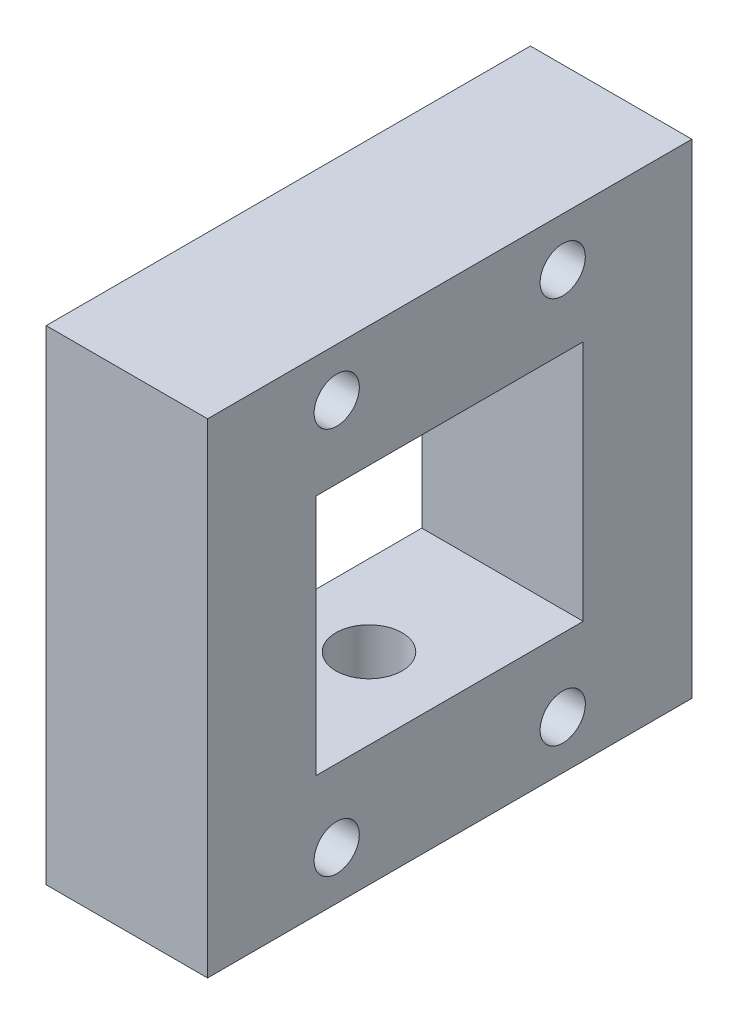
ISO-10303-21;
HEADER;
FILE_DESCRIPTION(('STEP AP214'),'2;1');
FILE_NAME('part.step','',(''),(''),'','','');
FILE_SCHEMA(('AUTOMOTIVE_DESIGN { 1 0 10303 214 1 1 1 1 }'));
ENDSEC;
DATA;
#1=APPLICATION_CONTEXT('core data for automotive mechanical design processes');
#2=APPLICATION_PROTOCOL_DEFINITION('international standard','automotive_design',2000,#1);
#3=PRODUCT_CONTEXT('',#1,'mechanical');
#4=PRODUCT('Part','Part','',(#3));
#5=PRODUCT_RELATED_PRODUCT_CATEGORY('part','',(#4));
#6=PRODUCT_DEFINITION_FORMATION('','',#4);
#7=PRODUCT_DEFINITION_CONTEXT('part definition',#1,'design');
#8=PRODUCT_DEFINITION('design','',#6,#7);
#9=PRODUCT_DEFINITION_SHAPE('','',#8);
#10=(LENGTH_UNIT() NAMED_UNIT(*) SI_UNIT(.MILLI.,.METRE.));
#11=(NAMED_UNIT(*) PLANE_ANGLE_UNIT() SI_UNIT($,.RADIAN.));
#12=(NAMED_UNIT(*) SI_UNIT($,.STERADIAN.) SOLID_ANGLE_UNIT());
#13=UNCERTAINTY_MEASURE_WITH_UNIT(LENGTH_MEASURE(1.E-05),#10,'distance_accuracy_value','');
#14=(GEOMETRIC_REPRESENTATION_CONTEXT(3) GLOBAL_UNCERTAINTY_ASSIGNED_CONTEXT((#13)) GLOBAL_UNIT_ASSIGNED_CONTEXT((#10,
#11,#12)) REPRESENTATION_CONTEXT('',''));
#15=CARTESIAN_POINT('',(0.,0.,0.));
#16=DIRECTION('',(0.,0.,1.));
#17=DIRECTION('',(1.,0.,0.));
#18=AXIS2_PLACEMENT_3D('',#15,#16,#17);
#19=CARTESIAN_POINT('',(10.,-12.,7.));
#20=DIRECTION('',(-1.,0.,0.));
#21=DIRECTION('',(0.,0.,1.));
#22=AXIS2_PLACEMENT_3D('',#19,#20,#21);
#23=CYLINDRICAL_SURFACE('',#22,1.4);
#24=CARTESIAN_POINT('',(1.875,-12.,7.));
#25=DIRECTION('',(-1.,0.,0.));
#26=DIRECTION('',(0.,0.,1.));
#27=AXIS2_PLACEMENT_3D('',#24,#25,#26);
#28=CIRCLE('',#27,1.4);
#29=CARTESIAN_POINT('',(1.875,-12.,8.4));
#30=VERTEX_POINT('',#29);
#31=EDGE_CURVE('E165',#30,#30,#28,.T.);
#32=ORIENTED_EDGE('',*,*,#31,.T.);
#33=EDGE_LOOP('',(#32));
#34=FACE_BOUND('',#33,.T.);
#35=CARTESIAN_POINT('',(10.,-12.,7.));
#36=DIRECTION('',(1.,0.,0.));
#37=DIRECTION('',(0.,0.,-1.));
#38=AXIS2_PLACEMENT_3D('',#35,#36,#37);
#39=CIRCLE('',#38,1.4);
#40=CARTESIAN_POINT('',(10.,-12.,5.6));
#41=VERTEX_POINT('',#40);
#42=EDGE_CURVE('E126',#41,#41,#39,.T.);
#43=ORIENTED_EDGE('',*,*,#42,.T.);
#44=EDGE_LOOP('',(#43));
#45=FACE_BOUND('',#44,.T.);
#46=ADVANCED_FACE('F32',(#34,#45),#23,.F.);
#47=CARTESIAN_POINT('',(10.,-12.,-7.));
#48=DIRECTION('',(-1.,0.,0.));
#49=DIRECTION('',(0.,0.,1.));
#50=AXIS2_PLACEMENT_3D('',#47,#48,#49);
#51=CYLINDRICAL_SURFACE('',#50,1.4);
#52=CARTESIAN_POINT('',(1.875,-12.,-7.));
#53=DIRECTION('',(-1.,0.,0.));
#54=DIRECTION('',(0.,0.,1.));
#55=AXIS2_PLACEMENT_3D('',#52,#53,#54);
#56=CIRCLE('',#55,1.4);
#57=CARTESIAN_POINT('',(1.875,-12.,-5.6));
#58=VERTEX_POINT('',#57);
#59=EDGE_CURVE('E174',#58,#58,#56,.T.);
#60=ORIENTED_EDGE('',*,*,#59,.T.);
#61=EDGE_LOOP('',(#60));
#62=FACE_BOUND('',#61,.T.);
#63=CARTESIAN_POINT('',(10.,-12.,-7.));
#64=DIRECTION('',(1.,0.,0.));
#65=DIRECTION('',(0.,0.,1.));
#66=AXIS2_PLACEMENT_3D('',#63,#64,#65);
#67=CIRCLE('',#66,1.4);
#68=CARTESIAN_POINT('',(10.,-12.,-5.6));
#69=VERTEX_POINT('',#68);
#70=EDGE_CURVE('E273',#69,#69,#67,.T.);
#71=ORIENTED_EDGE('',*,*,#70,.T.);
#72=EDGE_LOOP('',(#71));
#73=FACE_BOUND('',#72,.T.);
#74=ADVANCED_FACE('F196',(#62,#73),#51,.F.);
#75=CARTESIAN_POINT('',(10.,12.,7.));
#76=DIRECTION('',(-1.,0.,0.));
#77=DIRECTION('',(0.,0.,1.));
#78=AXIS2_PLACEMENT_3D('',#75,#76,#77);
#79=CYLINDRICAL_SURFACE('',#78,1.4);
#80=CARTESIAN_POINT('',(1.875,12.,7.));
#81=DIRECTION('',(-1.,0.,0.));
#82=DIRECTION('',(0.,0.,1.));
#83=AXIS2_PLACEMENT_3D('',#80,#81,#82);
#84=CIRCLE('',#83,1.4);
#85=CARTESIAN_POINT('',(1.875,12.,8.4));
#86=VERTEX_POINT('',#85);
#87=EDGE_CURVE('E168',#86,#86,#84,.T.);
#88=ORIENTED_EDGE('',*,*,#87,.T.);
#89=EDGE_LOOP('',(#88));
#90=FACE_BOUND('',#89,.T.);
#91=CARTESIAN_POINT('',(10.,12.,7.));
#92=DIRECTION('',(1.,0.,0.));
#93=DIRECTION('',(0.,0.,1.));
#94=AXIS2_PLACEMENT_3D('',#91,#92,#93);
#95=CIRCLE('',#94,1.4);
#96=CARTESIAN_POINT('',(10.,12.,8.4));
#97=VERTEX_POINT('',#96);
#98=EDGE_CURVE('E275',#97,#97,#95,.T.);
#99=ORIENTED_EDGE('',*,*,#98,.T.);
#100=EDGE_LOOP('',(#99));
#101=FACE_BOUND('',#100,.T.);
#102=ADVANCED_FACE('F202',(#90,#101),#79,.F.);
#103=CARTESIAN_POINT('',(10.,12.,-7.));
#104=DIRECTION('',(-1.,0.,0.));
#105=DIRECTION('',(0.,0.,1.));
#106=AXIS2_PLACEMENT_3D('',#103,#104,#105);
#107=CYLINDRICAL_SURFACE('',#106,1.4);
#108=CARTESIAN_POINT('',(1.875,12.,-7.));
#109=DIRECTION('',(-1.,0.,0.));
#110=DIRECTION('',(0.,0.,1.));
#111=AXIS2_PLACEMENT_3D('',#108,#109,#110);
#112=CIRCLE('',#111,1.4);
#113=CARTESIAN_POINT('',(1.875,12.,-5.6));
#114=VERTEX_POINT('',#113);
#115=EDGE_CURVE('E171',#114,#114,#112,.T.);
#116=ORIENTED_EDGE('',*,*,#115,.T.);
#117=EDGE_LOOP('',(#116));
#118=FACE_BOUND('',#117,.T.);
#119=CARTESIAN_POINT('',(10.,12.,-7.));
#120=DIRECTION('',(1.,0.,0.));
#121=DIRECTION('',(0.,0.,-1.));
#122=AXIS2_PLACEMENT_3D('',#119,#120,#121);
#123=CIRCLE('',#122,1.4);
#124=CARTESIAN_POINT('',(10.,12.,-8.4));
#125=VERTEX_POINT('',#124);
#126=EDGE_CURVE('E276',#125,#125,#123,.T.);
#127=ORIENTED_EDGE('',*,*,#126,.T.);
#128=EDGE_LOOP('',(#127));
#129=FACE_BOUND('',#128,.T.);
#130=ADVANCED_FACE('F225',(#118,#129),#107,.F.);
#131=CARTESIAN_POINT('',(10.,0.,0.));
#132=DIRECTION('',(1.,0.,0.));
#133=DIRECTION('',(0.,0.,-1.));
#134=AXIS2_PLACEMENT_3D('',#131,#132,#133);
#135=PLANE('',#134);
#136=ORIENTED_EDGE('',*,*,#126,.F.);
#137=EDGE_LOOP('',(#136));
#138=FACE_BOUND('',#137,.T.);
#139=ORIENTED_EDGE('',*,*,#70,.F.);
#140=EDGE_LOOP('',(#139));
#141=FACE_BOUND('',#140,.T.);
#142=ORIENTED_EDGE('',*,*,#98,.F.);
#143=EDGE_LOOP('',(#142));
#144=FACE_BOUND('',#143,.T.);
#145=ORIENTED_EDGE('',*,*,#42,.F.);
#146=EDGE_LOOP('',(#145));
#147=FACE_BOUND('',#146,.T.);
#148=DIRECTION('',(0.,1.,0.));
#149=VECTOR('',#148,1.);
#150=CARTESIAN_POINT('',(10.,15.,-15.));
#151=LINE('',#150,#149);
#152=CARTESIAN_POINT('',(10.,-15.,-15.));
#153=VERTEX_POINT('',#152);
#154=CARTESIAN_POINT('',(10.,15.,-15.));
#155=VERTEX_POINT('',#154);
#156=EDGE_CURVE('E136',#153,#155,#151,.T.);
#157=ORIENTED_EDGE('',*,*,#156,.T.);
#158=DIRECTION('',(0.,0.,1.));
#159=VECTOR('',#158,1.);
#160=CARTESIAN_POINT('',(10.,15.,15.));
#161=LINE('',#160,#159);
#162=CARTESIAN_POINT('',(10.,15.,15.));
#163=VERTEX_POINT('',#162);
#164=EDGE_CURVE('E139',#155,#163,#161,.T.);
#165=ORIENTED_EDGE('',*,*,#164,.T.);
#166=DIRECTION('',(0.,-1.,0.));
#167=VECTOR('',#166,1.);
#168=CARTESIAN_POINT('',(10.,15.,15.));
#169=LINE('',#168,#167);
#170=CARTESIAN_POINT('',(10.,-15.,15.));
#171=VERTEX_POINT('',#170);
#172=EDGE_CURVE('E142',#163,#171,#169,.T.);
#173=ORIENTED_EDGE('',*,*,#172,.T.);
#174=DIRECTION('',(0.,0.,-1.));
#175=VECTOR('',#174,1.);
#176=CARTESIAN_POINT('',(10.,-15.,15.));
#177=LINE('',#176,#175);
#178=EDGE_CURVE('E144',#171,#153,#177,.T.);
#179=ORIENTED_EDGE('',*,*,#178,.T.);
#180=EDGE_LOOP('',(#157,#165,#173,#179));
#181=FACE_BOUND('',#180,.T.);
#182=DIRECTION('',(0.,0.,1.));
#183=VECTOR('',#182,1.);
#184=CARTESIAN_POINT('',(10.,7.49999999999999,8.27025084197812));
#185=LINE('',#184,#183);
#186=CARTESIAN_POINT('',(10.,7.49999999999999,-8.27025084197812));
#187=VERTEX_POINT('',#186);
#188=CARTESIAN_POINT('',(10.,7.49999999999999,8.27025084197812));
#189=VERTEX_POINT('',#188);
#190=EDGE_CURVE('E105',#187,#189,#185,.T.);
#191=ORIENTED_EDGE('',*,*,#190,.F.);
#192=DIRECTION('',(0.,1.,0.));
#193=VECTOR('',#192,1.);
#194=CARTESIAN_POINT('',(10.,7.49999999999999,-8.27025084197812));
#195=LINE('',#194,#193);
#196=CARTESIAN_POINT('',(10.,-7.50000000000001,-8.27025084197812));
#197=VERTEX_POINT('',#196);
#198=EDGE_CURVE('E97',#197,#187,#195,.T.);
#199=ORIENTED_EDGE('',*,*,#198,.F.);
#200=DIRECTION('',(0.,0.,-1.));
#201=VECTOR('',#200,1.);
#202=CARTESIAN_POINT('',(10.,-7.50000000000001,8.27025084197812));
#203=LINE('',#202,#201);
#204=CARTESIAN_POINT('',(10.,-7.50000000000001,8.27025084197812));
#205=VERTEX_POINT('',#204);
#206=EDGE_CURVE('E120',#205,#197,#203,.T.);
#207=ORIENTED_EDGE('',*,*,#206,.F.);
#208=DIRECTION('',(0.,-1.,0.));
#209=VECTOR('',#208,1.);
#210=CARTESIAN_POINT('',(10.,7.49999999999999,8.27025084197812));
#211=LINE('',#210,#209);
#212=EDGE_CURVE('E118',#189,#205,#211,.T.);
#213=ORIENTED_EDGE('',*,*,#212,.F.);
#214=EDGE_LOOP('',(#191,#199,#207,#213));
#215=FACE_BOUND('',#214,.T.);
#216=ADVANCED_FACE('F117',(#138,#141,#144,#147,#181,#215),#135,.T.);
#217=CARTESIAN_POINT('',(0.,0.,0.));
#218=DIRECTION('',(1.,0.,0.));
#219=DIRECTION('',(0.,0.,-1.));
#220=AXIS2_PLACEMENT_3D('',#217,#218,#219);
#221=PLANE('',#220);
#222=CARTESIAN_POINT('',(0.,-12.,7.));
#223=DIRECTION('',(-1.,0.,0.));
#224=DIRECTION('',(0.,0.,1.));
#225=AXIS2_PLACEMENT_3D('',#222,#223,#224);
#226=CIRCLE('',#225,2.9);
#227=CARTESIAN_POINT('',(0.,-12.,9.9));
#228=VERTEX_POINT('',#227);
#229=EDGE_CURVE('E308',#228,#228,#226,.T.);
#230=ORIENTED_EDGE('',*,*,#229,.F.);
#231=EDGE_LOOP('',(#230));
#232=FACE_BOUND('',#231,.T.);
#233=CARTESIAN_POINT('',(0.,-12.,-7.));
#234=DIRECTION('',(-1.,0.,0.));
#235=DIRECTION('',(0.,0.,1.));
#236=AXIS2_PLACEMENT_3D('',#233,#234,#235);
#237=CIRCLE('',#236,2.9);
#238=CARTESIAN_POINT('',(0.,-12.,-4.1));
#239=VERTEX_POINT('',#238);
#240=EDGE_CURVE('E268',#239,#239,#237,.T.);
#241=ORIENTED_EDGE('',*,*,#240,.F.);
#242=EDGE_LOOP('',(#241));
#243=FACE_BOUND('',#242,.T.);
#244=CARTESIAN_POINT('',(0.,12.,7.));
#245=DIRECTION('',(-1.,0.,0.));
#246=DIRECTION('',(0.,0.,1.));
#247=AXIS2_PLACEMENT_3D('',#244,#245,#246);
#248=CIRCLE('',#247,2.9);
#249=CARTESIAN_POINT('',(0.,12.,9.9));
#250=VERTEX_POINT('',#249);
#251=EDGE_CURVE('E304',#250,#250,#248,.T.);
#252=ORIENTED_EDGE('',*,*,#251,.F.);
#253=EDGE_LOOP('',(#252));
#254=FACE_BOUND('',#253,.T.);
#255=CARTESIAN_POINT('',(0.,12.,-7.));
#256=DIRECTION('',(-1.,0.,0.));
#257=DIRECTION('',(0.,0.,1.));
#258=AXIS2_PLACEMENT_3D('',#255,#256,#257);
#259=CIRCLE('',#258,2.9);
#260=CARTESIAN_POINT('',(0.,12.,-4.1));
#261=VERTEX_POINT('',#260);
#262=EDGE_CURVE('E281',#261,#261,#259,.T.);
#263=ORIENTED_EDGE('',*,*,#262,.F.);
#264=EDGE_LOOP('',(#263));
#265=FACE_BOUND('',#264,.T.);
#266=DIRECTION('',(0.,1.,0.));
#267=VECTOR('',#266,1.);
#268=CARTESIAN_POINT('',(0.,15.,-15.));
#269=LINE('',#268,#267);
#270=CARTESIAN_POINT('',(0.,-15.,-15.));
#271=VERTEX_POINT('',#270);
#272=CARTESIAN_POINT('',(0.,15.,-15.));
#273=VERTEX_POINT('',#272);
#274=EDGE_CURVE('E113',#271,#273,#269,.T.);
#275=ORIENTED_EDGE('',*,*,#274,.F.);
#276=DIRECTION('',(0.,0.,-1.));
#277=VECTOR('',#276,1.);
#278=CARTESIAN_POINT('',(0.,-15.,15.));
#279=LINE('',#278,#277);
#280=CARTESIAN_POINT('',(0.,-15.,15.));
#281=VERTEX_POINT('',#280);
#282=EDGE_CURVE('E140',#281,#271,#279,.T.);
#283=ORIENTED_EDGE('',*,*,#282,.F.);
#284=DIRECTION('',(0.,-1.,0.));
#285=VECTOR('',#284,1.);
#286=CARTESIAN_POINT('',(0.,15.,15.));
#287=LINE('',#286,#285);
#288=CARTESIAN_POINT('',(0.,15.,15.));
#289=VERTEX_POINT('',#288);
#290=EDGE_CURVE('E151',#289,#281,#287,.T.);
#291=ORIENTED_EDGE('',*,*,#290,.F.);
#292=DIRECTION('',(0.,0.,1.));
#293=VECTOR('',#292,1.);
#294=CARTESIAN_POINT('',(0.,15.,15.));
#295=LINE('',#294,#293);
#296=EDGE_CURVE('E149',#273,#289,#295,.T.);
#297=ORIENTED_EDGE('',*,*,#296,.F.);
#298=EDGE_LOOP('',(#275,#283,#291,#297));
#299=FACE_BOUND('',#298,.T.);
#300=DIRECTION('',(0.,1.,0.));
#301=VECTOR('',#300,1.);
#302=CARTESIAN_POINT('',(0.,7.49999999999999,-8.27025084197812));
#303=LINE('',#302,#301);
#304=CARTESIAN_POINT('',(0.,-7.50000000000001,-8.27025084197812));
#305=VERTEX_POINT('',#304);
#306=CARTESIAN_POINT('',(0.,7.49999999999999,-8.27025084197812));
#307=VERTEX_POINT('',#306);
#308=EDGE_CURVE('E55',#305,#307,#303,.T.);
#309=ORIENTED_EDGE('',*,*,#308,.T.);
#310=DIRECTION('',(0.,0.,1.));
#311=VECTOR('',#310,1.);
#312=CARTESIAN_POINT('',(0.,7.49999999999999,8.27025084197812));
#313=LINE('',#312,#311);
#314=CARTESIAN_POINT('',(0.,7.49999999999999,8.27025084197812));
#315=VERTEX_POINT('',#314);
#316=EDGE_CURVE('E112',#307,#315,#313,.T.);
#317=ORIENTED_EDGE('',*,*,#316,.T.);
#318=DIRECTION('',(0.,-1.,0.));
#319=VECTOR('',#318,1.);
#320=CARTESIAN_POINT('',(0.,7.49999999999999,8.27025084197812));
#321=LINE('',#320,#319);
#322=CARTESIAN_POINT('',(0.,-7.50000000000001,8.27025084197812));
#323=VERTEX_POINT('',#322);
#324=EDGE_CURVE('E128',#315,#323,#321,.T.);
#325=ORIENTED_EDGE('',*,*,#324,.T.);
#326=DIRECTION('',(0.,0.,-1.));
#327=VECTOR('',#326,1.);
#328=CARTESIAN_POINT('',(0.,-7.50000000000001,8.27025084197812));
#329=LINE('',#328,#327);
#330=EDGE_CURVE('E106',#323,#305,#329,.T.);
#331=ORIENTED_EDGE('',*,*,#330,.T.);
#332=EDGE_LOOP('',(#309,#317,#325,#331));
#333=FACE_BOUND('',#332,.T.);
#334=ADVANCED_FACE('F224',(#232,#243,#254,#265,#299,#333),#221,.F.);
#335=CARTESIAN_POINT('',(10.,15.,-15.));
#336=DIRECTION('',(0.,0.,1.));
#337=DIRECTION('',(0.,-1.,0.));
#338=AXIS2_PLACEMENT_3D('',#335,#336,#337);
#339=PLANE('',#338);
#340=ORIENTED_EDGE('',*,*,#274,.T.);
#341=DIRECTION('',(-1.,0.,0.));
#342=VECTOR('',#341,1.);
#343=CARTESIAN_POINT('',(10.,15.,-15.));
#344=LINE('',#343,#342);
#345=EDGE_CURVE('E162',#155,#273,#344,.T.);
#346=ORIENTED_EDGE('',*,*,#345,.F.);
#347=ORIENTED_EDGE('',*,*,#156,.F.);
#348=DIRECTION('',(-1.,0.,0.));
#349=VECTOR('',#348,1.);
#350=CARTESIAN_POINT('',(10.,-15.,-15.));
#351=LINE('',#350,#349);
#352=EDGE_CURVE('E146',#153,#271,#351,.T.);
#353=ORIENTED_EDGE('',*,*,#352,.T.);
#354=EDGE_LOOP('',(#340,#346,#347,#353));
#355=FACE_BOUND('',#354,.T.);
#356=ADVANCED_FACE('F229',(#355),#339,.F.);
#357=CARTESIAN_POINT('',(10.,15.,15.));
#358=DIRECTION('',(0.,-1.,0.));
#359=DIRECTION('',(0.,0.,-1.));
#360=AXIS2_PLACEMENT_3D('',#357,#358,#359);
#361=PLANE('',#360);
#362=ORIENTED_EDGE('',*,*,#296,.T.);
#363=DIRECTION('',(-1.,0.,0.));
#364=VECTOR('',#363,1.);
#365=CARTESIAN_POINT('',(10.,15.,15.));
#366=LINE('',#365,#364);
#367=EDGE_CURVE('E159',#163,#289,#366,.T.);
#368=ORIENTED_EDGE('',*,*,#367,.F.);
#369=ORIENTED_EDGE('',*,*,#164,.F.);
#370=ORIENTED_EDGE('',*,*,#345,.T.);
#371=EDGE_LOOP('',(#362,#368,#369,#370));
#372=FACE_BOUND('',#371,.T.);
#373=ADVANCED_FACE('F237',(#372),#361,.F.);
#374=CARTESIAN_POINT('',(10.,15.,15.));
#375=DIRECTION('',(0.,0.,-1.));
#376=DIRECTION('',(0.,1.,0.));
#377=AXIS2_PLACEMENT_3D('',#374,#375,#376);
#378=PLANE('',#377);
#379=ORIENTED_EDGE('',*,*,#290,.T.);
#380=DIRECTION('',(-1.,0.,0.));
#381=VECTOR('',#380,1.);
#382=CARTESIAN_POINT('',(10.,-15.,15.));
#383=LINE('',#382,#381);
#384=EDGE_CURVE('E156',#171,#281,#383,.T.);
#385=ORIENTED_EDGE('',*,*,#384,.F.);
#386=ORIENTED_EDGE('',*,*,#172,.F.);
#387=ORIENTED_EDGE('',*,*,#367,.T.);
#388=EDGE_LOOP('',(#379,#385,#386,#387));
#389=FACE_BOUND('',#388,.T.);
#390=ADVANCED_FACE('F233',(#389),#378,.F.);
#391=CARTESIAN_POINT('',(10.,-15.,15.));
#392=DIRECTION('',(0.,1.,0.));
#393=DIRECTION('',(0.,0.,1.));
#394=AXIS2_PLACEMENT_3D('',#391,#392,#393);
#395=PLANE('',#394);
#396=CARTESIAN_POINT('',(5.,-15.,0.));
#397=DIRECTION('',(0.,1.,0.));
#398=DIRECTION('',(0.,0.,1.));
#399=AXIS2_PLACEMENT_3D('',#396,#397,#398);
#400=CIRCLE('',#399,2.05);
#401=CARTESIAN_POINT('',(5.,-15.,2.05));
#402=VERTEX_POINT('',#401);
#403=EDGE_CURVE('E179',#402,#402,#400,.T.);
#404=ORIENTED_EDGE('',*,*,#403,.T.);
#405=EDGE_LOOP('',(#404));
#406=FACE_BOUND('',#405,.T.);
#407=ORIENTED_EDGE('',*,*,#282,.T.);
#408=ORIENTED_EDGE('',*,*,#352,.F.);
#409=ORIENTED_EDGE('',*,*,#178,.F.);
#410=ORIENTED_EDGE('',*,*,#384,.T.);
#411=EDGE_LOOP('',(#407,#408,#409,#410));
#412=FACE_BOUND('',#411,.T.);
#413=ADVANCED_FACE('F221',(#406,#412),#395,.F.);
#414=CARTESIAN_POINT('',(10.,7.49999999999999,-8.27025084197812));
#415=DIRECTION('',(0.,0.,1.));
#416=DIRECTION('',(0.,-1.,0.));
#417=AXIS2_PLACEMENT_3D('',#414,#415,#416);
#418=PLANE('',#417);
#419=ORIENTED_EDGE('',*,*,#308,.F.);
#420=DIRECTION('',(-1.,0.,0.));
#421=VECTOR('',#420,1.);
#422=CARTESIAN_POINT('',(10.,-7.50000000000001,-8.27025084197812));
#423=LINE('',#422,#421);
#424=EDGE_CURVE('E101',#197,#305,#423,.T.);
#425=ORIENTED_EDGE('',*,*,#424,.F.);
#426=ORIENTED_EDGE('',*,*,#198,.T.);
#427=DIRECTION('',(-1.,0.,0.));
#428=VECTOR('',#427,1.);
#429=CARTESIAN_POINT('',(10.,7.49999999999999,-8.27025084197812));
#430=LINE('',#429,#428);
#431=EDGE_CURVE('E100',#187,#307,#430,.T.);
#432=ORIENTED_EDGE('',*,*,#431,.T.);
#433=EDGE_LOOP('',(#419,#425,#426,#432));
#434=FACE_BOUND('',#433,.T.);
#435=ADVANCED_FACE('F99',(#434),#418,.T.);
#436=CARTESIAN_POINT('',(10.,7.49999999999999,8.27025084197812));
#437=DIRECTION('',(0.,-1.,0.));
#438=DIRECTION('',(0.,0.,-1.));
#439=AXIS2_PLACEMENT_3D('',#436,#437,#438);
#440=PLANE('',#439);
#441=CARTESIAN_POINT('',(5.,7.49999999999999,0.));
#442=DIRECTION('',(0.,-1.,0.));
#443=DIRECTION('',(0.,0.,-1.));
#444=AXIS2_PLACEMENT_3D('',#441,#442,#443);
#445=CIRCLE('',#444,2.8);
#446=CARTESIAN_POINT('',(5.,7.49999999999999,-2.79999999999999));
#447=VERTEX_POINT('',#446);
#448=EDGE_CURVE('E313',#447,#447,#445,.T.);
#449=ORIENTED_EDGE('',*,*,#448,.F.);
#450=EDGE_LOOP('',(#449));
#451=FACE_BOUND('',#450,.T.);
#452=ORIENTED_EDGE('',*,*,#316,.F.);
#453=ORIENTED_EDGE('',*,*,#431,.F.);
#454=ORIENTED_EDGE('',*,*,#190,.T.);
#455=DIRECTION('',(-1.,0.,0.));
#456=VECTOR('',#455,1.);
#457=CARTESIAN_POINT('',(10.,7.49999999999999,8.27025084197812));
#458=LINE('',#457,#456);
#459=EDGE_CURVE('E114',#189,#315,#458,.T.);
#460=ORIENTED_EDGE('',*,*,#459,.T.);
#461=EDGE_LOOP('',(#452,#453,#454,#460));
#462=FACE_BOUND('',#461,.T.);
#463=ADVANCED_FACE('F109',(#451,#462),#440,.T.);
#464=CARTESIAN_POINT('',(10.,7.49999999999999,8.27025084197812));
#465=DIRECTION('',(0.,0.,-1.));
#466=DIRECTION('',(0.,1.,0.));
#467=AXIS2_PLACEMENT_3D('',#464,#465,#466);
#468=PLANE('',#467);
#469=ORIENTED_EDGE('',*,*,#324,.F.);
#470=ORIENTED_EDGE('',*,*,#459,.F.);
#471=ORIENTED_EDGE('',*,*,#212,.T.);
#472=DIRECTION('',(-1.,0.,0.));
#473=VECTOR('',#472,1.);
#474=CARTESIAN_POINT('',(10.,-7.50000000000001,8.27025084197812));
#475=LINE('',#474,#473);
#476=EDGE_CURVE('E47',#205,#323,#475,.T.);
#477=ORIENTED_EDGE('',*,*,#476,.T.);
#478=EDGE_LOOP('',(#469,#470,#471,#477));
#479=FACE_BOUND('',#478,.T.);
#480=ADVANCED_FACE('F212',(#479),#468,.T.);
#481=CARTESIAN_POINT('',(10.,-7.50000000000001,8.27025084197812));
#482=DIRECTION('',(0.,1.,0.));
#483=DIRECTION('',(0.,0.,1.));
#484=AXIS2_PLACEMENT_3D('',#481,#482,#483);
#485=PLANE('',#484);
#486=CARTESIAN_POINT('',(5.,-7.50000000000001,0.));
#487=DIRECTION('',(0.,1.,0.));
#488=DIRECTION('',(0.,0.,1.));
#489=AXIS2_PLACEMENT_3D('',#486,#487,#488);
#490=CIRCLE('',#489,2.05);
#491=CARTESIAN_POINT('',(5.,-7.50000000000001,2.05));
#492=VERTEX_POINT('',#491);
#493=EDGE_CURVE('E177',#492,#492,#490,.T.);
#494=ORIENTED_EDGE('',*,*,#493,.F.);
#495=EDGE_LOOP('',(#494));
#496=FACE_BOUND('',#495,.T.);
#497=ORIENTED_EDGE('',*,*,#330,.F.);
#498=ORIENTED_EDGE('',*,*,#476,.F.);
#499=ORIENTED_EDGE('',*,*,#206,.T.);
#500=ORIENTED_EDGE('',*,*,#424,.T.);
#501=EDGE_LOOP('',(#497,#498,#499,#500));
#502=FACE_BOUND('',#501,.T.);
#503=ADVANCED_FACE('F208',(#496,#502),#485,.T.);
#504=CARTESIAN_POINT('',(2.,-12.,7.));
#505=DIRECTION('',(-1.,0.,0.));
#506=DIRECTION('',(0.,0.,1.));
#507=AXIS2_PLACEMENT_3D('',#504,#505,#506);
#508=CONICAL_SURFACE('',#507,1.3,0.674740942223553);
#509=ORIENTED_EDGE('',*,*,#229,.T.);
#510=EDGE_LOOP('',(#509));
#511=FACE_BOUND('',#510,.T.);
#512=ORIENTED_EDGE('',*,*,#31,.F.);
#513=EDGE_LOOP('',(#512));
#514=FACE_BOUND('',#513,.T.);
#515=ADVANCED_FACE('F211',(#511,#514),#508,.F.);
#516=CARTESIAN_POINT('',(2.,12.,7.));
#517=DIRECTION('',(-1.,0.,0.));
#518=DIRECTION('',(0.,0.,1.));
#519=AXIS2_PLACEMENT_3D('',#516,#517,#518);
#520=CONICAL_SURFACE('',#519,1.3,0.674740942223553);
#521=ORIENTED_EDGE('',*,*,#251,.T.);
#522=EDGE_LOOP('',(#521));
#523=FACE_BOUND('',#522,.T.);
#524=ORIENTED_EDGE('',*,*,#87,.F.);
#525=EDGE_LOOP('',(#524));
#526=FACE_BOUND('',#525,.T.);
#527=ADVANCED_FACE('F247',(#523,#526),#520,.F.);
#528=CARTESIAN_POINT('',(2.,12.,-7.));
#529=DIRECTION('',(-1.,0.,0.));
#530=DIRECTION('',(0.,0.,1.));
#531=AXIS2_PLACEMENT_3D('',#528,#529,#530);
#532=CONICAL_SURFACE('',#531,1.3,0.674740942223553);
#533=ORIENTED_EDGE('',*,*,#262,.T.);
#534=EDGE_LOOP('',(#533));
#535=FACE_BOUND('',#534,.T.);
#536=ORIENTED_EDGE('',*,*,#115,.F.);
#537=EDGE_LOOP('',(#536));
#538=FACE_BOUND('',#537,.T.);
#539=ADVANCED_FACE('F251',(#535,#538),#532,.F.);
#540=CARTESIAN_POINT('',(2.,-12.,-7.));
#541=DIRECTION('',(-1.,0.,0.));
#542=DIRECTION('',(0.,0.,1.));
#543=AXIS2_PLACEMENT_3D('',#540,#541,#542);
#544=CONICAL_SURFACE('',#543,1.3,0.674740942223553);
#545=ORIENTED_EDGE('',*,*,#240,.T.);
#546=EDGE_LOOP('',(#545));
#547=FACE_BOUND('',#546,.T.);
#548=ORIENTED_EDGE('',*,*,#59,.F.);
#549=EDGE_LOOP('',(#548));
#550=FACE_BOUND('',#549,.T.);
#551=ADVANCED_FACE('F254',(#547,#550),#544,.F.);
#552=CARTESIAN_POINT('',(5.,-20.,0.));
#553=DIRECTION('',(0.,1.,0.));
#554=DIRECTION('',(0.,0.,1.));
#555=AXIS2_PLACEMENT_3D('',#552,#553,#554);
#556=CYLINDRICAL_SURFACE('',#555,2.05);
#557=ORIENTED_EDGE('',*,*,#493,.T.);
#558=EDGE_LOOP('',(#557));
#559=FACE_BOUND('',#558,.T.);
#560=ORIENTED_EDGE('',*,*,#403,.F.);
#561=EDGE_LOOP('',(#560));
#562=FACE_BOUND('',#561,.T.);
#563=ADVANCED_FACE('F257',(#559,#562),#556,.F.);
#564=CARTESIAN_POINT('',(5.,12.5,0.));
#565=DIRECTION('',(0.,-1.,0.));
#566=DIRECTION('',(0.,0.,-1.));
#567=AXIS2_PLACEMENT_3D('',#564,#565,#566);
#568=CYLINDRICAL_SURFACE('',#567,2.8);
#569=CARTESIAN_POINT('',(5.,12.5,0.));
#570=DIRECTION('',(0.,-1.,0.));
#571=DIRECTION('',(0.,0.,-1.));
#572=AXIS2_PLACEMENT_3D('',#569,#570,#571);
#573=CIRCLE('',#572,2.8);
#574=CARTESIAN_POINT('',(5.,12.5,-2.79999999999999));
#575=VERTEX_POINT('',#574);
#576=EDGE_CURVE('E180',#575,#575,#573,.T.);
#577=ORIENTED_EDGE('',*,*,#576,.F.);
#578=EDGE_LOOP('',(#577));
#579=FACE_BOUND('',#578,.T.);
#580=ORIENTED_EDGE('',*,*,#448,.T.);
#581=EDGE_LOOP('',(#580));
#582=FACE_BOUND('',#581,.T.);
#583=ADVANCED_FACE('F262',(#579,#582),#568,.F.);
#584=CARTESIAN_POINT('',(5.,12.5,0.));
#585=DIRECTION('',(0.,-1.,0.));
#586=DIRECTION('',(0.,0.,-1.));
#587=AXIS2_PLACEMENT_3D('',#584,#585,#586);
#588=PLANE('',#587);
#589=CARTESIAN_POINT('',(5.,12.5,0.));
#590=DIRECTION('',(0.,-1.,0.));
#591=DIRECTION('',(0.,0.,-1.));
#592=AXIS2_PLACEMENT_3D('',#589,#590,#591);
#593=CIRCLE('',#592,2.2);
#594=CARTESIAN_POINT('',(5.,12.5,-2.19999999999999));
#595=VERTEX_POINT('',#594);
#596=EDGE_CURVE('E316',#595,#595,#593,.T.);
#597=ORIENTED_EDGE('',*,*,#596,.F.);
#598=EDGE_LOOP('',(#597));
#599=FACE_BOUND('',#598,.T.);
#600=ORIENTED_EDGE('',*,*,#576,.T.);
#601=EDGE_LOOP('',(#600));
#602=FACE_BOUND('',#601,.T.);
#603=ADVANCED_FACE('F323',(#599,#602),#588,.T.);
#604=CARTESIAN_POINT('',(5.,12.5,0.));
#605=DIRECTION('',(0.,-1.,0.));
#606=DIRECTION('',(0.,0.,-1.));
#607=AXIS2_PLACEMENT_3D('',#604,#605,#606);
#608=CYLINDRICAL_SURFACE('',#607,2.2);
#609=CARTESIAN_POINT('',(5.,8.49999999999999,0.));
#610=DIRECTION('',(0.,-1.,0.));
#611=DIRECTION('',(0.,0.,-1.));
#612=AXIS2_PLACEMENT_3D('',#609,#610,#611);
#613=CIRCLE('',#612,2.2);
#614=CARTESIAN_POINT('',(5.,8.49999999999999,-2.19999999999999));
#615=VERTEX_POINT('',#614);
#616=EDGE_CURVE('E11',#615,#615,#613,.F.);
#617=ORIENTED_EDGE('',*,*,#616,.T.);
#618=EDGE_LOOP('',(#617));
#619=FACE_BOUND('',#618,.T.);
#620=ORIENTED_EDGE('',*,*,#596,.T.);
#621=EDGE_LOOP('',(#620));
#622=FACE_BOUND('',#621,.T.);
#623=ADVANCED_FACE('F192',(#619,#622),#608,.T.);
#624=CARTESIAN_POINT('',(5.,7.49999999999999,0.));
#625=DIRECTION('',(0.,-1.,0.));
#626=DIRECTION('',(0.,0.,-1.));
#627=AXIS2_PLACEMENT_3D('',#624,#625,#626);
#628=CIRCLE('',#627,1.2);
#629=CARTESIAN_POINT('',(5.,7.49999999999999,-1.19999999999999));
#630=VERTEX_POINT('',#629);
#631=EDGE_CURVE('E40',#630,#630,#628,.T.);
#632=ORIENTED_EDGE('',*,*,#631,.T.);
#633=EDGE_LOOP('',(#632));
#634=FACE_BOUND('',#633,.T.);
#635=ADVANCED_FACE('F184',(#634),#440,.T.);
#636=CARTESIAN_POINT('',(5.,8.49999999999999,0.));
#637=DIRECTION('',(0.,-1.,0.));
#638=DIRECTION('',(0.,0.,-1.));
#639=AXIS2_PLACEMENT_3D('',#636,#637,#638);
#640=TOROIDAL_SURFACE('',#639,1.2,1.);
#641=ORIENTED_EDGE('',*,*,#616,.F.);
#642=EDGE_LOOP('',(#641));
#643=FACE_BOUND('',#642,.T.);
#644=ORIENTED_EDGE('',*,*,#631,.F.);
#645=EDGE_LOOP('',(#644));
#646=FACE_BOUND('',#645,.T.);
#647=ADVANCED_FACE('F34',(#643,#646),#640,.T.);
#648=CLOSED_SHELL('',(#46,#74,#102,#130,#216,#334,#356,#373,#390,#413,#435,#463,#480,#503,#515,
#527,#539,#551,#563,#583,#603,#623,#635,#647));
#649=MANIFOLD_SOLID_BREP('B2',#648);
#650=ADVANCED_BREP_SHAPE_REPRESENTATION('',(#18,#649),#14);
#651=SHAPE_DEFINITION_REPRESENTATION(#9,#650);
ENDSEC;
END-ISO-10303-21;
